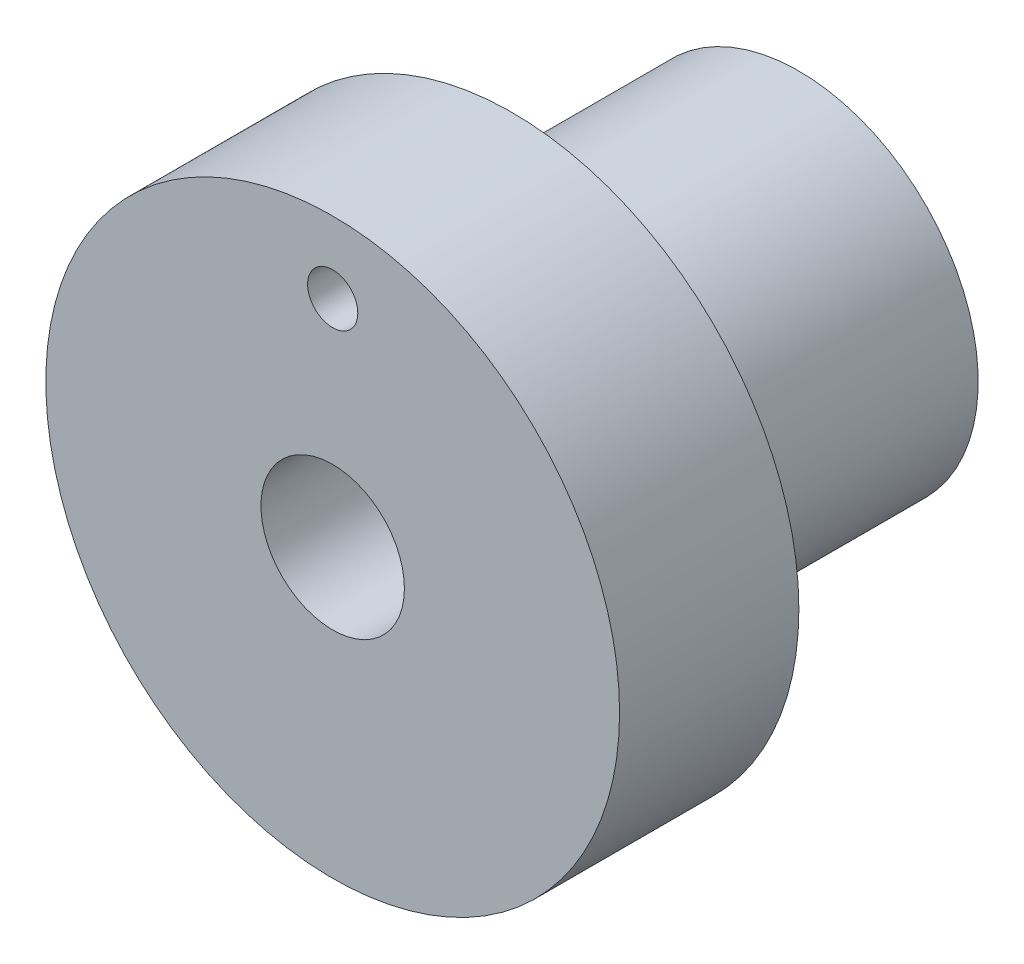
ISO-10303-21;
HEADER;
FILE_DESCRIPTION(('STEP AP214'),'2;1');
FILE_NAME('part.step','',(''),(''),'','','');
FILE_SCHEMA(('AUTOMOTIVE_DESIGN { 1 0 10303 214 1 1 1 1 }'));
ENDSEC;
DATA;
#1=APPLICATION_CONTEXT('core data for automotive mechanical design processes');
#2=APPLICATION_PROTOCOL_DEFINITION('international standard','automotive_design',2000,#1);
#3=PRODUCT_CONTEXT('',#1,'mechanical');
#4=PRODUCT('Part','Part','',(#3));
#5=PRODUCT_RELATED_PRODUCT_CATEGORY('part','',(#4));
#6=PRODUCT_DEFINITION_FORMATION('','',#4);
#7=PRODUCT_DEFINITION_CONTEXT('part definition',#1,'design');
#8=PRODUCT_DEFINITION('design','',#6,#7);
#9=PRODUCT_DEFINITION_SHAPE('','',#8);
#10=(LENGTH_UNIT() NAMED_UNIT(*) SI_UNIT(.MILLI.,.METRE.));
#11=(NAMED_UNIT(*) PLANE_ANGLE_UNIT() SI_UNIT($,.RADIAN.));
#12=(NAMED_UNIT(*) SI_UNIT($,.STERADIAN.) SOLID_ANGLE_UNIT());
#13=UNCERTAINTY_MEASURE_WITH_UNIT(LENGTH_MEASURE(1.E-05),#10,'distance_accuracy_value','');
#14=(GEOMETRIC_REPRESENTATION_CONTEXT(3) GLOBAL_UNCERTAINTY_ASSIGNED_CONTEXT((#13)) GLOBAL_UNIT_ASSIGNED_CONTEXT((#10,
#11,#12)) REPRESENTATION_CONTEXT('',''));
#15=CARTESIAN_POINT('',(0.,0.,0.));
#16=DIRECTION('',(0.,0.,1.));
#17=DIRECTION('',(1.,0.,0.));
#18=AXIS2_PLACEMENT_3D('',#15,#16,#17);
#19=CARTESIAN_POINT('',(0.,0.,-25.));
#20=DIRECTION('',(0.,0.,1.));
#21=DIRECTION('',(1.,0.,0.));
#22=AXIS2_PLACEMENT_3D('',#19,#20,#21);
#23=CYLINDRICAL_SURFACE('',#22,40.);
#24=CARTESIAN_POINT('',(0.,0.,-25.));
#25=DIRECTION('',(0.,0.,1.));
#26=DIRECTION('',(1.,0.,0.));
#27=AXIS2_PLACEMENT_3D('',#24,#25,#26);
#28=CIRCLE('',#27,40.);
#29=CARTESIAN_POINT('',(40.,0.,-25.));
#30=VERTEX_POINT('',#29);
#31=EDGE_CURVE('E52',#30,#30,#28,.T.);
#32=ORIENTED_EDGE('',*,*,#31,.T.);
#33=EDGE_LOOP('',(#32));
#34=FACE_BOUND('',#33,.T.);
#35=CARTESIAN_POINT('',(0.,0.,0.));
#36=DIRECTION('',(0.,0.,1.));
#37=DIRECTION('',(1.,0.,0.));
#38=AXIS2_PLACEMENT_3D('',#35,#36,#37);
#39=CIRCLE('',#38,40.);
#40=CARTESIAN_POINT('',(40.,0.,0.));
#41=VERTEX_POINT('',#40);
#42=EDGE_CURVE('E48',#41,#41,#39,.T.);
#43=ORIENTED_EDGE('',*,*,#42,.F.);
#44=EDGE_LOOP('',(#43));
#45=FACE_BOUND('',#44,.T.);
#46=ADVANCED_FACE('F45',(#34,#45),#23,.T.);
#47=CARTESIAN_POINT('',(0.,0.,-25.));
#48=DIRECTION('',(0.,0.,1.));
#49=DIRECTION('',(1.,0.,0.));
#50=AXIS2_PLACEMENT_3D('',#47,#48,#49);
#51=PLANE('',#50);
#52=CARTESIAN_POINT('',(0.,30.,-25.));
#53=DIRECTION('',(0.,0.,1.));
#54=DIRECTION('',(1.,0.,0.));
#55=AXIS2_PLACEMENT_3D('',#52,#53,#54);
#56=CIRCLE('',#55,3.5);
#57=CARTESIAN_POINT('',(3.5,30.,-25.));
#58=VERTEX_POINT('',#57);
#59=EDGE_CURVE('E65',#58,#58,#56,.T.);
#60=ORIENTED_EDGE('',*,*,#59,.T.);
#61=EDGE_LOOP('',(#60));
#62=FACE_BOUND('',#61,.T.);
#63=CARTESIAN_POINT('',(0.,0.,-25.));
#64=DIRECTION('',(0.,0.,-1.));
#65=DIRECTION('',(-1.,0.,0.));
#66=AXIS2_PLACEMENT_3D('',#63,#64,#65);
#67=CIRCLE('',#66,25.);
#68=CARTESIAN_POINT('',(-25.,0.,-25.));
#69=VERTEX_POINT('',#68);
#70=EDGE_CURVE('E10',#69,#69,#67,.T.);
#71=ORIENTED_EDGE('',*,*,#70,.F.);
#72=EDGE_LOOP('',(#71));
#73=FACE_BOUND('',#72,.T.);
#74=ORIENTED_EDGE('',*,*,#31,.F.);
#75=EDGE_LOOP('',(#74));
#76=FACE_BOUND('',#75,.T.);
#77=ADVANCED_FACE('F81',(#62,#73,#76),#51,.F.);
#78=CARTESIAN_POINT('',(0.,0.,0.));
#79=DIRECTION('',(0.,0.,1.));
#80=DIRECTION('',(1.,0.,0.));
#81=AXIS2_PLACEMENT_3D('',#78,#79,#80);
#82=PLANE('',#81);
#83=CARTESIAN_POINT('',(0.,30.,0.));
#84=DIRECTION('',(0.,0.,1.));
#85=DIRECTION('',(1.,0.,0.));
#86=AXIS2_PLACEMENT_3D('',#83,#84,#85);
#87=CIRCLE('',#86,3.5);
#88=CARTESIAN_POINT('',(3.5,30.,0.));
#89=VERTEX_POINT('',#88);
#90=EDGE_CURVE('E70',#89,#89,#87,.T.);
#91=ORIENTED_EDGE('',*,*,#90,.F.);
#92=EDGE_LOOP('',(#91));
#93=FACE_BOUND('',#92,.T.);
#94=CARTESIAN_POINT('',(0.,0.,0.));
#95=DIRECTION('',(0.,0.,1.));
#96=DIRECTION('',(1.,0.,0.));
#97=AXIS2_PLACEMENT_3D('',#94,#95,#96);
#98=CIRCLE('',#97,10.);
#99=CARTESIAN_POINT('',(10.,0.,0.));
#100=VERTEX_POINT('',#99);
#101=EDGE_CURVE('E62',#100,#100,#98,.T.);
#102=ORIENTED_EDGE('',*,*,#101,.F.);
#103=EDGE_LOOP('',(#102));
#104=FACE_BOUND('',#103,.T.);
#105=ORIENTED_EDGE('',*,*,#42,.T.);
#106=EDGE_LOOP('',(#105));
#107=FACE_BOUND('',#106,.T.);
#108=ADVANCED_FACE('F77',(#93,#104,#107),#82,.T.);
#109=CARTESIAN_POINT('',(0.,0.,-65.));
#110=DIRECTION('',(0.,0.,1.));
#111=DIRECTION('',(1.,0.,0.));
#112=AXIS2_PLACEMENT_3D('',#109,#110,#111);
#113=CYLINDRICAL_SURFACE('',#112,25.);
#114=CARTESIAN_POINT('',(0.,0.,-65.));
#115=DIRECTION('',(0.,0.,-1.));
#116=DIRECTION('',(-1.,0.,0.));
#117=AXIS2_PLACEMENT_3D('',#114,#115,#116);
#118=CIRCLE('',#117,25.);
#119=CARTESIAN_POINT('',(-25.,0.,-65.));
#120=VERTEX_POINT('',#119);
#121=EDGE_CURVE('E58',#120,#120,#118,.T.);
#122=ORIENTED_EDGE('',*,*,#121,.F.);
#123=EDGE_LOOP('',(#122));
#124=FACE_BOUND('',#123,.T.);
#125=ORIENTED_EDGE('',*,*,#70,.T.);
#126=EDGE_LOOP('',(#125));
#127=FACE_BOUND('',#126,.T.);
#128=ADVANCED_FACE('F80',(#124,#127),#113,.T.);
#129=CARTESIAN_POINT('',(0.,0.,-65.));
#130=DIRECTION('',(0.,0.,-1.));
#131=DIRECTION('',(-1.,0.,0.));
#132=AXIS2_PLACEMENT_3D('',#129,#130,#131);
#133=PLANE('',#132);
#134=CARTESIAN_POINT('',(0.,0.,-65.));
#135=DIRECTION('',(0.,0.,1.));
#136=DIRECTION('',(1.,0.,0.));
#137=AXIS2_PLACEMENT_3D('',#134,#135,#136);
#138=CIRCLE('',#137,10.);
#139=CARTESIAN_POINT('',(10.,0.,-65.));
#140=VERTEX_POINT('',#139);
#141=EDGE_CURVE('E61',#140,#140,#138,.T.);
#142=ORIENTED_EDGE('',*,*,#141,.T.);
#143=EDGE_LOOP('',(#142));
#144=FACE_BOUND('',#143,.T.);
#145=ORIENTED_EDGE('',*,*,#121,.T.);
#146=EDGE_LOOP('',(#145));
#147=FACE_BOUND('',#146,.T.);
#148=ADVANCED_FACE('F104',(#144,#147),#133,.T.);
#149=CARTESIAN_POINT('',(0.,0.,-65.));
#150=DIRECTION('',(0.,0.,1.));
#151=DIRECTION('',(1.,0.,0.));
#152=AXIS2_PLACEMENT_3D('',#149,#150,#151);
#153=CYLINDRICAL_SURFACE('',#152,10.);
#154=ORIENTED_EDGE('',*,*,#141,.F.);
#155=EDGE_LOOP('',(#154));
#156=FACE_BOUND('',#155,.T.);
#157=ORIENTED_EDGE('',*,*,#101,.T.);
#158=EDGE_LOOP('',(#157));
#159=FACE_BOUND('',#158,.T.);
#160=ADVANCED_FACE('F108',(#156,#159),#153,.F.);
#161=CARTESIAN_POINT('',(0.,30.,-65.));
#162=DIRECTION('',(0.,0.,1.));
#163=DIRECTION('',(1.,0.,0.));
#164=AXIS2_PLACEMENT_3D('',#161,#162,#163);
#165=CYLINDRICAL_SURFACE('',#164,3.5);
#166=ORIENTED_EDGE('',*,*,#90,.T.);
#167=EDGE_LOOP('',(#166));
#168=FACE_BOUND('',#167,.T.);
#169=ORIENTED_EDGE('',*,*,#59,.F.);
#170=EDGE_LOOP('',(#169));
#171=FACE_BOUND('',#170,.T.);
#172=ADVANCED_FACE('F74',(#168,#171),#165,.F.);
#173=CLOSED_SHELL('',(#46,#77,#108,#128,#148,#160,#172));
#174=MANIFOLD_SOLID_BREP('B2',#173);
#175=ADVANCED_BREP_SHAPE_REPRESENTATION('',(#18,#174),#14);
#176=SHAPE_DEFINITION_REPRESENTATION(#9,#175);
ENDSEC;
END-ISO-10303-21;
